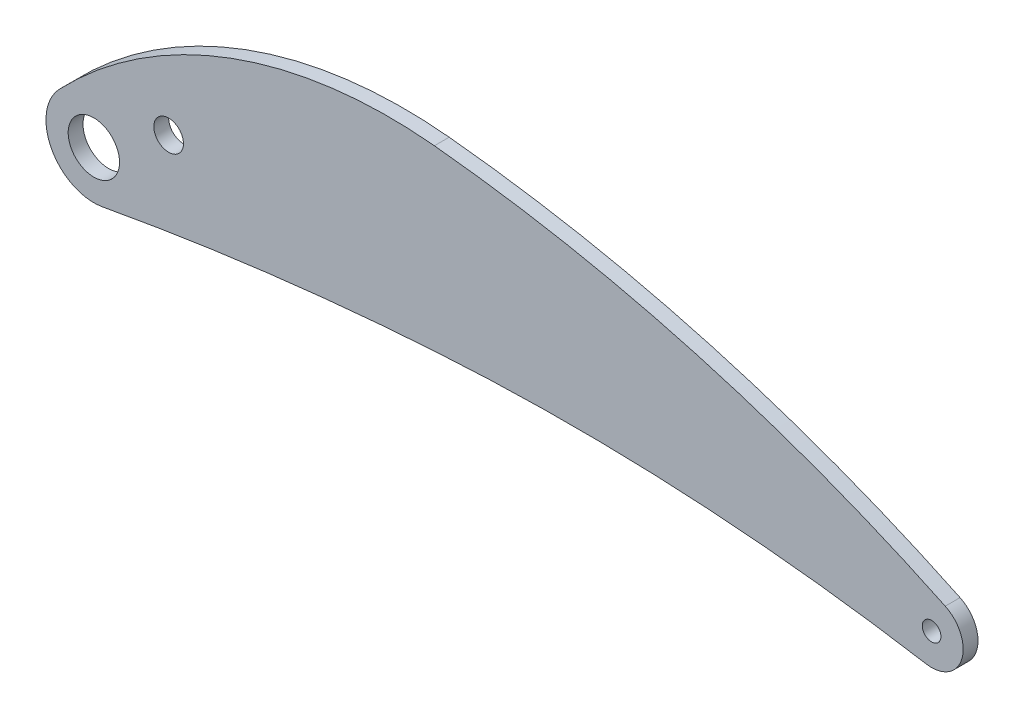
ISO-10303-21;
HEADER;
FILE_DESCRIPTION(('STEP AP214'),'2;1');
FILE_NAME('part.step','',(''),(''),'','','');
FILE_SCHEMA(('AUTOMOTIVE_DESIGN { 1 0 10303 214 1 1 1 1 }'));
ENDSEC;
DATA;
#1=APPLICATION_CONTEXT('core data for automotive mechanical design processes');
#2=APPLICATION_PROTOCOL_DEFINITION('international standard','automotive_design',2000,#1);
#3=PRODUCT_CONTEXT('',#1,'mechanical');
#4=PRODUCT('Part','Part','',(#3));
#5=PRODUCT_RELATED_PRODUCT_CATEGORY('part','',(#4));
#6=PRODUCT_DEFINITION_FORMATION('','',#4);
#7=PRODUCT_DEFINITION_CONTEXT('part definition',#1,'design');
#8=PRODUCT_DEFINITION('design','',#6,#7);
#9=PRODUCT_DEFINITION_SHAPE('','',#8);
#10=(LENGTH_UNIT() NAMED_UNIT(*) SI_UNIT(.MILLI.,.METRE.));
#11=(NAMED_UNIT(*) PLANE_ANGLE_UNIT() SI_UNIT($,.RADIAN.));
#12=(NAMED_UNIT(*) SI_UNIT($,.STERADIAN.) SOLID_ANGLE_UNIT());
#13=UNCERTAINTY_MEASURE_WITH_UNIT(LENGTH_MEASURE(1.E-05),#10,'distance_accuracy_value','');
#14=(GEOMETRIC_REPRESENTATION_CONTEXT(3) GLOBAL_UNCERTAINTY_ASSIGNED_CONTEXT((#13)) GLOBAL_UNIT_ASSIGNED_CONTEXT((#10,
#11,#12)) REPRESENTATION_CONTEXT('',''));
#15=CARTESIAN_POINT('',(0.,0.,0.));
#16=DIRECTION('',(0.,0.,1.));
#17=DIRECTION('',(1.,0.,0.));
#18=AXIS2_PLACEMENT_3D('',#15,#16,#17);
#19=CARTESIAN_POINT('',(219.330072004526,-291.778114891459,6.35));
#20=DIRECTION('',(0.,0.,-1.));
#21=DIRECTION('',(-1.,0.,0.));
#22=AXIS2_PLACEMENT_3D('',#19,#20,#21);
#23=PLANE('',#22);
#24=CARTESIAN_POINT('',(32.0513718548499,20.5990184771541,6.35));
#25=DIRECTION('',(0.,0.,-1.));
#26=DIRECTION('',(-1.,0.,0.));
#27=AXIS2_PLACEMENT_3D('',#24,#25,#26);
#28=CIRCLE('',#27,6.35000000000002);
#29=CARTESIAN_POINT('',(25.7013718548499,20.5990184771541,6.35));
#30=VERTEX_POINT('',#29);
#31=EDGE_CURVE('E184',#30,#30,#28,.T.);
#32=ORIENTED_EDGE('',*,*,#31,.T.);
#33=EDGE_LOOP('',(#32));
#34=FACE_BOUND('',#33,.T.);
#35=CARTESIAN_POINT('',(79.6601440090517,-583.556229782919,6.35));
#36=DIRECTION('',(0.,0.,1.));
#37=DIRECTION('',(-1.,0.,0.));
#38=AXIS2_PLACEMENT_3D('',#35,#36,#37);
#39=CIRCLE('',#38,660.493800224167);
#40=CARTESIAN_POINT('',(364.839650306118,12.1993487245125,6.35));
#41=VERTEX_POINT('',#40);
#42=CARTESIAN_POINT('',(145.926048807493,73.6050061370084,6.35));
#43=VERTEX_POINT('',#42);
#44=EDGE_CURVE('E135',#41,#43,#39,.T.);
#45=ORIENTED_EDGE('',*,*,#44,.T.);
#46=CARTESIAN_POINT('',(126.343729189818,-120.593524785832,6.35));
#47=DIRECTION('',(0.,0.,1.));
#48=DIRECTION('',(-1.,0.,0.));
#49=AXIS2_PLACEMENT_3D('',#46,#47,#48);
#50=CIRCLE('',#49,195.183341128791);
#51=CARTESIAN_POINT('',(-14.8473014507153,14.1715653557252,6.35));
#52=VERTEX_POINT('',#51);
#53=EDGE_CURVE('E93',#43,#52,#50,.T.);
#54=ORIENTED_EDGE('',*,*,#53,.T.);
#55=CARTESIAN_POINT('',(0.,0.,6.35));
#56=DIRECTION('',(0.,0.,1.));
#57=DIRECTION('',(1.,0.,0.));
#58=AXIS2_PLACEMENT_3D('',#55,#56,#57);
#59=CIRCLE('',#58,20.5250000000002);
#60=CARTESIAN_POINT('',(3.69983543829339,-20.1887801198972,6.35));
#61=VERTEX_POINT('',#60);
#62=EDGE_CURVE('E106',#52,#61,#59,.T.);
#63=ORIENTED_EDGE('',*,*,#62,.T.);
#64=CARTESIAN_POINT('',(225.861487868323,-1232.45154877205,6.35));
#65=DIRECTION('',(0.,0.,-1.));
#66=DIRECTION('',(-1.,0.,0.));
#67=AXIS2_PLACEMENT_3D('',#64,#65,#66);
#68=CIRCLE('',#67,1232.45154877205);
#69=CARTESIAN_POINT('',(145.926048807493,-2.59499386299211,6.35));
#70=VERTEX_POINT('',#69);
#71=EDGE_CURVE('E100',#61,#70,#68,.T.);
#72=ORIENTED_EDGE('',*,*,#71,.T.);
#73=CARTESIAN_POINT('',(205.17012305493,-914.102003879944,6.35));
#74=DIRECTION('',(0.,0.,-1.));
#75=DIRECTION('',(-1.,0.,0.));
#76=AXIS2_PLACEMENT_3D('',#73,#74,#75);
#77=CIRCLE('',#76,913.430287237882);
#78=CARTESIAN_POINT('',(356.755502218579,-13.3374605794806,6.35));
#79=VERTEX_POINT('',#78);
#80=EDGE_CURVE('E104',#70,#79,#77,.T.);
#81=ORIENTED_EDGE('',*,*,#80,.T.);
#82=CARTESIAN_POINT('',(359.,0.,6.35));
#83=DIRECTION('',(0.,0.,1.));
#84=DIRECTION('',(1.,0.,0.));
#85=AXIS2_PLACEMENT_3D('',#82,#83,#84);
#86=CIRCLE('',#85,13.5250000000002);
#87=EDGE_CURVE('E56',#79,#41,#86,.T.);
#88=ORIENTED_EDGE('',*,*,#87,.T.);
#89=EDGE_LOOP('',(#45,#54,#63,#72,#81,#88));
#90=FACE_BOUND('',#89,.T.);
#91=CARTESIAN_POINT('',(0.,0.,6.35));
#92=DIRECTION('',(0.,0.,1.));
#93=DIRECTION('',(1.,0.,0.));
#94=AXIS2_PLACEMENT_3D('',#91,#92,#93);
#95=CIRCLE('',#94,11.);
#96=CARTESIAN_POINT('',(11.,0.,6.35));
#97=VERTEX_POINT('',#96);
#98=EDGE_CURVE('E128',#97,#97,#95,.T.);
#99=ORIENTED_EDGE('',*,*,#98,.F.);
#100=EDGE_LOOP('',(#99));
#101=FACE_BOUND('',#100,.T.);
#102=CARTESIAN_POINT('',(359.,0.,6.35));
#103=DIRECTION('',(0.,0.,1.));
#104=DIRECTION('',(1.,0.,0.));
#105=AXIS2_PLACEMENT_3D('',#102,#103,#104);
#106=CIRCLE('',#105,3.99999999999999);
#107=CARTESIAN_POINT('',(363.,0.,6.35));
#108=VERTEX_POINT('',#107);
#109=EDGE_CURVE('E188',#108,#108,#106,.T.);
#110=ORIENTED_EDGE('',*,*,#109,.F.);
#111=EDGE_LOOP('',(#110));
#112=FACE_BOUND('',#111,.T.);
#113=ADVANCED_FACE('F39',(#34,#90,#101,#112),#23,.F.);
#114=CARTESIAN_POINT('',(219.330072004526,-291.778114891459,0.));
#115=DIRECTION('',(0.,0.,-1.));
#116=DIRECTION('',(-1.,0.,0.));
#117=AXIS2_PLACEMENT_3D('',#114,#115,#116);
#118=PLANE('',#117);
#119=CARTESIAN_POINT('',(32.0513718548499,20.5990184771541,0.));
#120=DIRECTION('',(0.,0.,1.));
#121=DIRECTION('',(1.,0.,0.));
#122=AXIS2_PLACEMENT_3D('',#119,#120,#121);
#123=CIRCLE('',#122,6.35000000000002);
#124=CARTESIAN_POINT('',(38.4013718548499,20.5990184771541,0.));
#125=VERTEX_POINT('',#124);
#126=EDGE_CURVE('E182',#125,#125,#123,.T.);
#127=ORIENTED_EDGE('',*,*,#126,.T.);
#128=EDGE_LOOP('',(#127));
#129=FACE_BOUND('',#128,.T.);
#130=CARTESIAN_POINT('',(0.,0.,0.));
#131=DIRECTION('',(0.,0.,1.));
#132=DIRECTION('',(1.,0.,0.));
#133=AXIS2_PLACEMENT_3D('',#130,#131,#132);
#134=CIRCLE('',#133,11.);
#135=CARTESIAN_POINT('',(11.,0.,0.));
#136=VERTEX_POINT('',#135);
#137=EDGE_CURVE('E193',#136,#136,#134,.T.);
#138=ORIENTED_EDGE('',*,*,#137,.T.);
#139=EDGE_LOOP('',(#138));
#140=FACE_BOUND('',#139,.T.);
#141=CARTESIAN_POINT('',(79.6601440090517,-583.556229782919,0.));
#142=DIRECTION('',(0.,0.,1.));
#143=DIRECTION('',(-1.,0.,0.));
#144=AXIS2_PLACEMENT_3D('',#141,#142,#143);
#145=CIRCLE('',#144,660.493800224167);
#146=CARTESIAN_POINT('',(364.839650306118,12.1993487245125,0.));
#147=VERTEX_POINT('',#146);
#148=CARTESIAN_POINT('',(145.926048807493,73.6050061370084,0.));
#149=VERTEX_POINT('',#148);
#150=EDGE_CURVE('E124',#147,#149,#145,.T.);
#151=ORIENTED_EDGE('',*,*,#150,.F.);
#152=CARTESIAN_POINT('',(359.,0.,0.));
#153=DIRECTION('',(0.,0.,1.));
#154=DIRECTION('',(1.,0.,0.));
#155=AXIS2_PLACEMENT_3D('',#152,#153,#154);
#156=CIRCLE('',#155,13.5250000000002);
#157=CARTESIAN_POINT('',(356.755502218579,-13.3374605794806,0.));
#158=VERTEX_POINT('',#157);
#159=EDGE_CURVE('E85',#158,#147,#156,.T.);
#160=ORIENTED_EDGE('',*,*,#159,.F.);
#161=CARTESIAN_POINT('',(205.17012305493,-914.102003879944,0.));
#162=DIRECTION('',(0.,0.,-1.));
#163=DIRECTION('',(-1.,0.,0.));
#164=AXIS2_PLACEMENT_3D('',#161,#162,#163);
#165=CIRCLE('',#164,913.430287237882);
#166=CARTESIAN_POINT('',(145.926048807493,-2.59499386299211,0.));
#167=VERTEX_POINT('',#166);
#168=EDGE_CURVE('E79',#167,#158,#165,.T.);
#169=ORIENTED_EDGE('',*,*,#168,.F.);
#170=CARTESIAN_POINT('',(225.861487868323,-1232.45154877205,0.));
#171=DIRECTION('',(0.,0.,-1.));
#172=DIRECTION('',(-1.,0.,0.));
#173=AXIS2_PLACEMENT_3D('',#170,#171,#172);
#174=CIRCLE('',#173,1232.45154877205);
#175=CARTESIAN_POINT('',(3.69983543829339,-20.1887801198972,0.));
#176=VERTEX_POINT('',#175);
#177=EDGE_CURVE('E114',#176,#167,#174,.T.);
#178=ORIENTED_EDGE('',*,*,#177,.F.);
#179=CARTESIAN_POINT('',(0.,0.,0.));
#180=DIRECTION('',(0.,0.,1.));
#181=DIRECTION('',(1.,0.,0.));
#182=AXIS2_PLACEMENT_3D('',#179,#180,#181);
#183=CIRCLE('',#182,20.5250000000002);
#184=CARTESIAN_POINT('',(-14.8473014507153,14.1715653557252,0.));
#185=VERTEX_POINT('',#184);
#186=EDGE_CURVE('E130',#185,#176,#183,.T.);
#187=ORIENTED_EDGE('',*,*,#186,.F.);
#188=CARTESIAN_POINT('',(126.343729189818,-120.593524785832,0.));
#189=DIRECTION('',(0.,0.,1.));
#190=DIRECTION('',(-1.,0.,0.));
#191=AXIS2_PLACEMENT_3D('',#188,#189,#190);
#192=CIRCLE('',#191,195.183341128791);
#193=EDGE_CURVE('E127',#149,#185,#192,.T.);
#194=ORIENTED_EDGE('',*,*,#193,.F.);
#195=EDGE_LOOP('',(#151,#160,#169,#178,#187,#194));
#196=FACE_BOUND('',#195,.T.);
#197=CARTESIAN_POINT('',(359.,0.,0.));
#198=DIRECTION('',(0.,0.,1.));
#199=DIRECTION('',(1.,0.,0.));
#200=AXIS2_PLACEMENT_3D('',#197,#198,#199);
#201=CIRCLE('',#200,3.99999999999999);
#202=CARTESIAN_POINT('',(363.,0.,0.));
#203=VERTEX_POINT('',#202);
#204=EDGE_CURVE('E185',#203,#203,#201,.T.);
#205=ORIENTED_EDGE('',*,*,#204,.T.);
#206=EDGE_LOOP('',(#205));
#207=FACE_BOUND('',#206,.T.);
#208=ADVANCED_FACE('F144',(#129,#140,#196,#207),#118,.T.);
#209=CARTESIAN_POINT('',(79.6601440090517,-583.556229782919,6.35));
#210=DIRECTION('',(0.,0.,-1.));
#211=DIRECTION('',(-1.,0.,0.));
#212=AXIS2_PLACEMENT_3D('',#209,#210,#211);
#213=CYLINDRICAL_SURFACE('',#212,660.493800224167);
#214=ORIENTED_EDGE('',*,*,#150,.T.);
#215=DIRECTION('',(0.,0.,-1.));
#216=VECTOR('',#215,1.);
#217=CARTESIAN_POINT('',(145.926048807493,73.6050061370084,6.35));
#218=LINE('',#217,#216);
#219=EDGE_CURVE('E11',#43,#149,#218,.T.);
#220=ORIENTED_EDGE('',*,*,#219,.F.);
#221=ORIENTED_EDGE('',*,*,#44,.F.);
#222=DIRECTION('',(0.,0.,-1.));
#223=VECTOR('',#222,1.);
#224=CARTESIAN_POINT('',(364.839650306118,12.1993487245125,6.35));
#225=LINE('',#224,#223);
#226=EDGE_CURVE('E120',#41,#147,#225,.T.);
#227=ORIENTED_EDGE('',*,*,#226,.T.);
#228=EDGE_LOOP('',(#214,#220,#221,#227));
#229=FACE_BOUND('',#228,.T.);
#230=ADVANCED_FACE('F41',(#229),#213,.T.);
#231=CARTESIAN_POINT('',(126.343729189818,-120.593524785832,6.35));
#232=DIRECTION('',(0.,0.,-1.));
#233=DIRECTION('',(-1.,0.,0.));
#234=AXIS2_PLACEMENT_3D('',#231,#232,#233);
#235=CYLINDRICAL_SURFACE('',#234,195.183341128791);
#236=ORIENTED_EDGE('',*,*,#193,.T.);
#237=DIRECTION('',(0.,0.,-1.));
#238=VECTOR('',#237,1.);
#239=CARTESIAN_POINT('',(-14.8473014507153,14.1715653557252,6.35));
#240=LINE('',#239,#238);
#241=EDGE_CURVE('E48',#52,#185,#240,.T.);
#242=ORIENTED_EDGE('',*,*,#241,.F.);
#243=ORIENTED_EDGE('',*,*,#53,.F.);
#244=ORIENTED_EDGE('',*,*,#219,.T.);
#245=EDGE_LOOP('',(#236,#242,#243,#244));
#246=FACE_BOUND('',#245,.T.);
#247=ADVANCED_FACE('F227',(#246),#235,.T.);
#248=CARTESIAN_POINT('',(0.,0.,6.35));
#249=DIRECTION('',(0.,0.,-1.));
#250=DIRECTION('',(-1.,0.,0.));
#251=AXIS2_PLACEMENT_3D('',#248,#249,#250);
#252=CYLINDRICAL_SURFACE('',#251,20.5250000000002);
#253=ORIENTED_EDGE('',*,*,#186,.T.);
#254=DIRECTION('',(0.,0.,-1.));
#255=VECTOR('',#254,1.);
#256=CARTESIAN_POINT('',(3.69983543829339,-20.1887801198972,6.35));
#257=LINE('',#256,#255);
#258=EDGE_CURVE('E115',#61,#176,#257,.T.);
#259=ORIENTED_EDGE('',*,*,#258,.F.);
#260=ORIENTED_EDGE('',*,*,#62,.F.);
#261=ORIENTED_EDGE('',*,*,#241,.T.);
#262=EDGE_LOOP('',(#253,#259,#260,#261));
#263=FACE_BOUND('',#262,.T.);
#264=ADVANCED_FACE('F141',(#263),#252,.T.);
#265=CARTESIAN_POINT('',(225.861487868323,-1232.45154877205,6.35));
#266=DIRECTION('',(0.,0.,-1.));
#267=DIRECTION('',(-1.,0.,0.));
#268=AXIS2_PLACEMENT_3D('',#265,#266,#267);
#269=CYLINDRICAL_SURFACE('',#268,1232.45154877205);
#270=ORIENTED_EDGE('',*,*,#177,.T.);
#271=DIRECTION('',(0.,0.,-1.));
#272=VECTOR('',#271,1.);
#273=CARTESIAN_POINT('',(145.926048807493,-2.59499386299211,6.35));
#274=LINE('',#273,#272);
#275=EDGE_CURVE('E111',#70,#167,#274,.T.);
#276=ORIENTED_EDGE('',*,*,#275,.F.);
#277=ORIENTED_EDGE('',*,*,#71,.F.);
#278=ORIENTED_EDGE('',*,*,#258,.T.);
#279=EDGE_LOOP('',(#270,#276,#277,#278));
#280=FACE_BOUND('',#279,.T.);
#281=ADVANCED_FACE('F112',(#280),#269,.F.);
#282=CARTESIAN_POINT('',(205.17012305493,-914.102003879944,6.35));
#283=DIRECTION('',(0.,0.,-1.));
#284=DIRECTION('',(-1.,0.,0.));
#285=AXIS2_PLACEMENT_3D('',#282,#283,#284);
#286=CYLINDRICAL_SURFACE('',#285,913.430287237882);
#287=ORIENTED_EDGE('',*,*,#168,.T.);
#288=DIRECTION('',(0.,0.,-1.));
#289=VECTOR('',#288,1.);
#290=CARTESIAN_POINT('',(356.755502218579,-13.3374605794806,6.35));
#291=LINE('',#290,#289);
#292=EDGE_CURVE('E116',#79,#158,#291,.T.);
#293=ORIENTED_EDGE('',*,*,#292,.F.);
#294=ORIENTED_EDGE('',*,*,#80,.F.);
#295=ORIENTED_EDGE('',*,*,#275,.T.);
#296=EDGE_LOOP('',(#287,#293,#294,#295));
#297=FACE_BOUND('',#296,.T.);
#298=ADVANCED_FACE('F118',(#297),#286,.F.);
#299=CARTESIAN_POINT('',(359.,0.,6.35));
#300=DIRECTION('',(0.,0.,-1.));
#301=DIRECTION('',(-1.,0.,0.));
#302=AXIS2_PLACEMENT_3D('',#299,#300,#301);
#303=CYLINDRICAL_SURFACE('',#302,13.5250000000002);
#304=ORIENTED_EDGE('',*,*,#159,.T.);
#305=ORIENTED_EDGE('',*,*,#226,.F.);
#306=ORIENTED_EDGE('',*,*,#87,.F.);
#307=ORIENTED_EDGE('',*,*,#292,.T.);
#308=EDGE_LOOP('',(#304,#305,#306,#307));
#309=FACE_BOUND('',#308,.T.);
#310=ADVANCED_FACE('F149',(#309),#303,.T.);
#311=CARTESIAN_POINT('',(0.,0.,6.35));
#312=DIRECTION('',(0.,0.,-1.));
#313=DIRECTION('',(-1.,0.,0.));
#314=AXIS2_PLACEMENT_3D('',#311,#312,#313);
#315=CYLINDRICAL_SURFACE('',#314,11.);
#316=ORIENTED_EDGE('',*,*,#98,.T.);
#317=EDGE_LOOP('',(#316));
#318=FACE_BOUND('',#317,.T.);
#319=ORIENTED_EDGE('',*,*,#137,.F.);
#320=EDGE_LOOP('',(#319));
#321=FACE_BOUND('',#320,.T.);
#322=ADVANCED_FACE('F151',(#318,#321),#315,.F.);
#323=CARTESIAN_POINT('',(359.,0.,6.35));
#324=DIRECTION('',(0.,0.,-1.));
#325=DIRECTION('',(-1.,0.,0.));
#326=AXIS2_PLACEMENT_3D('',#323,#324,#325);
#327=CYLINDRICAL_SURFACE('',#326,3.99999999999999);
#328=ORIENTED_EDGE('',*,*,#109,.T.);
#329=EDGE_LOOP('',(#328));
#330=FACE_BOUND('',#329,.T.);
#331=ORIENTED_EDGE('',*,*,#204,.F.);
#332=EDGE_LOOP('',(#331));
#333=FACE_BOUND('',#332,.T.);
#334=ADVANCED_FACE('F157',(#330,#333),#327,.F.);
#335=CARTESIAN_POINT('',(32.0513718548499,20.5990184771541,0.));
#336=DIRECTION('',(0.,0.,1.));
#337=DIRECTION('',(1.,0.,0.));
#338=AXIS2_PLACEMENT_3D('',#335,#336,#337);
#339=CYLINDRICAL_SURFACE('',#338,6.35000000000002);
#340=ORIENTED_EDGE('',*,*,#126,.F.);
#341=EDGE_LOOP('',(#340));
#342=FACE_BOUND('',#341,.T.);
#343=ORIENTED_EDGE('',*,*,#31,.F.);
#344=EDGE_LOOP('',(#343));
#345=FACE_BOUND('',#344,.T.);
#346=ADVANCED_FACE('F173',(#342,#345),#339,.F.);
#347=CLOSED_SHELL('',(#113,#208,#230,#247,#264,#281,#298,#310,#322,#334,#346));
#348=MANIFOLD_SOLID_BREP('B2',#347);
#349=ADVANCED_BREP_SHAPE_REPRESENTATION('',(#18,#348),#14);
#350=SHAPE_DEFINITION_REPRESENTATION(#9,#349);
ENDSEC;
END-ISO-10303-21;
